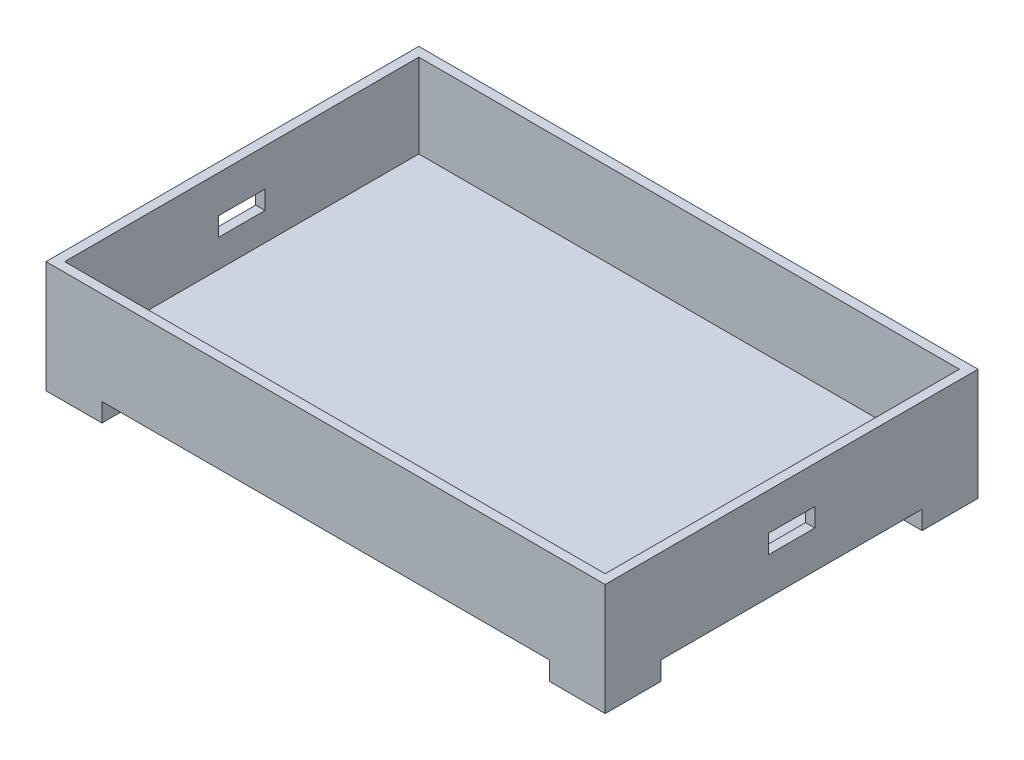
ISO-10303-21;
HEADER;
FILE_DESCRIPTION(('STEP AP214'),'2;1');
FILE_NAME('part.step','',(''),(''),'','','');
FILE_SCHEMA(('AUTOMOTIVE_DESIGN { 1 0 10303 214 1 1 1 1 }'));
ENDSEC;
DATA;
#1=APPLICATION_CONTEXT('core data for automotive mechanical design processes');
#2=APPLICATION_PROTOCOL_DEFINITION('international standard','automotive_design',2000,#1);
#3=PRODUCT_CONTEXT('',#1,'mechanical');
#4=PRODUCT('Part','Part','',(#3));
#5=PRODUCT_RELATED_PRODUCT_CATEGORY('part','',(#4));
#6=PRODUCT_DEFINITION_FORMATION('','',#4);
#7=PRODUCT_DEFINITION_CONTEXT('part definition',#1,'design');
#8=PRODUCT_DEFINITION('design','',#6,#7);
#9=PRODUCT_DEFINITION_SHAPE('','',#8);
#10=(LENGTH_UNIT() NAMED_UNIT(*) SI_UNIT(.MILLI.,.METRE.));
#11=(NAMED_UNIT(*) PLANE_ANGLE_UNIT() SI_UNIT($,.RADIAN.));
#12=(NAMED_UNIT(*) SI_UNIT($,.STERADIAN.) SOLID_ANGLE_UNIT());
#13=UNCERTAINTY_MEASURE_WITH_UNIT(LENGTH_MEASURE(1.E-05),#10,'distance_accuracy_value','');
#14=(GEOMETRIC_REPRESENTATION_CONTEXT(3) GLOBAL_UNCERTAINTY_ASSIGNED_CONTEXT((#13)) GLOBAL_UNIT_ASSIGNED_CONTEXT((#10,
#11,#12)) REPRESENTATION_CONTEXT('',''));
#15=CARTESIAN_POINT('',(0.,0.,0.));
#16=DIRECTION('',(0.,0.,1.));
#17=DIRECTION('',(1.,0.,0.));
#18=AXIS2_PLACEMENT_3D('',#15,#16,#17);
#19=CARTESIAN_POINT('',(0.,0.,0.));
#20=DIRECTION('',(0.,1.,0.));
#21=DIRECTION('',(0.,0.,1.));
#22=AXIS2_PLACEMENT_3D('',#19,#20,#21);
#23=PLANE('',#22);
#24=DIRECTION('',(1.,0.,0.));
#25=VECTOR('',#24,1.);
#26=CARTESIAN_POINT('',(30.,0.,14.));
#27=LINE('',#26,#25);
#28=CARTESIAN_POINT('',(24.,0.,14.));
#29=VERTEX_POINT('',#28);
#30=CARTESIAN_POINT('',(30.,0.,14.));
#31=VERTEX_POINT('',#30);
#32=EDGE_CURVE('E247',#29,#31,#27,.T.);
#33=ORIENTED_EDGE('',*,*,#32,.F.);
#34=DIRECTION('',(0.,0.,-1.));
#35=VECTOR('',#34,1.);
#36=CARTESIAN_POINT('',(24.,0.,14.));
#37=LINE('',#36,#35);
#38=CARTESIAN_POINT('',(24.,0.,20.));
#39=VERTEX_POINT('',#38);
#40=EDGE_CURVE('E235',#39,#29,#37,.T.);
#41=ORIENTED_EDGE('',*,*,#40,.F.);
#42=DIRECTION('',(1.,0.,0.));
#43=VECTOR('',#42,1.);
#44=CARTESIAN_POINT('',(-30.,0.,20.));
#45=LINE('',#44,#43);
#46=CARTESIAN_POINT('',(-24.,0.,20.));
#47=VERTEX_POINT('',#46);
#48=EDGE_CURVE('E476',#47,#39,#45,.T.);
#49=ORIENTED_EDGE('',*,*,#48,.F.);
#50=DIRECTION('',(0.,0.,1.));
#51=VECTOR('',#50,1.);
#52=CARTESIAN_POINT('',(-24.,0.,14.));
#53=LINE('',#52,#51);
#54=CARTESIAN_POINT('',(-24.,0.,14.));
#55=VERTEX_POINT('',#54);
#56=EDGE_CURVE('E339',#55,#47,#53,.T.);
#57=ORIENTED_EDGE('',*,*,#56,.F.);
#58=DIRECTION('',(1.,0.,0.));
#59=VECTOR('',#58,1.);
#60=CARTESIAN_POINT('',(-30.,0.,14.));
#61=LINE('',#60,#59);
#62=CARTESIAN_POINT('',(-30.,0.,14.));
#63=VERTEX_POINT('',#62);
#64=EDGE_CURVE('E322',#63,#55,#61,.T.);
#65=ORIENTED_EDGE('',*,*,#64,.F.);
#66=DIRECTION('',(0.,0.,1.));
#67=VECTOR('',#66,1.);
#68=CARTESIAN_POINT('',(-30.,0.,-20.));
#69=LINE('',#68,#67);
#70=CARTESIAN_POINT('',(-30.,0.,-14.));
#71=VERTEX_POINT('',#70);
#72=EDGE_CURVE('E491',#71,#63,#69,.T.);
#73=ORIENTED_EDGE('',*,*,#72,.F.);
#74=DIRECTION('',(-1.,0.,0.));
#75=VECTOR('',#74,1.);
#76=CARTESIAN_POINT('',(-24.,0.,-14.));
#77=LINE('',#76,#75);
#78=CARTESIAN_POINT('',(-24.,0.,-14.));
#79=VERTEX_POINT('',#78);
#80=EDGE_CURVE('E315',#79,#71,#77,.T.);
#81=ORIENTED_EDGE('',*,*,#80,.F.);
#82=DIRECTION('',(0.,0.,1.));
#83=VECTOR('',#82,1.);
#84=CARTESIAN_POINT('',(-24.,0.,-20.));
#85=LINE('',#84,#83);
#86=CARTESIAN_POINT('',(-24.,0.,-20.));
#87=VERTEX_POINT('',#86);
#88=EDGE_CURVE('E318',#87,#79,#85,.T.);
#89=ORIENTED_EDGE('',*,*,#88,.F.);
#90=DIRECTION('',(-1.,0.,0.));
#91=VECTOR('',#90,1.);
#92=CARTESIAN_POINT('',(-30.,0.,-20.));
#93=LINE('',#92,#91);
#94=CARTESIAN_POINT('',(24.,0.,-20.));
#95=VERTEX_POINT('',#94);
#96=EDGE_CURVE('E488',#95,#87,#93,.T.);
#97=ORIENTED_EDGE('',*,*,#96,.F.);
#98=DIRECTION('',(0.,0.,-1.));
#99=VECTOR('',#98,1.);
#100=CARTESIAN_POINT('',(24.,0.,-20.));
#101=LINE('',#100,#99);
#102=CARTESIAN_POINT('',(24.,0.,-14.));
#103=VERTEX_POINT('',#102);
#104=EDGE_CURVE('E63',#103,#95,#101,.T.);
#105=ORIENTED_EDGE('',*,*,#104,.F.);
#106=DIRECTION('',(-1.,0.,0.));
#107=VECTOR('',#106,1.);
#108=CARTESIAN_POINT('',(24.,0.,-14.));
#109=LINE('',#108,#107);
#110=CARTESIAN_POINT('',(30.,0.,-14.));
#111=VERTEX_POINT('',#110);
#112=EDGE_CURVE('E286',#111,#103,#109,.T.);
#113=ORIENTED_EDGE('',*,*,#112,.F.);
#114=DIRECTION('',(0.,0.,-1.));
#115=VECTOR('',#114,1.);
#116=CARTESIAN_POINT('',(30.,0.,-20.));
#117=LINE('',#116,#115);
#118=EDGE_CURVE('E260',#31,#111,#117,.T.);
#119=ORIENTED_EDGE('',*,*,#118,.F.);
#120=EDGE_LOOP('',(#33,#41,#49,#57,#65,#73,#81,#89,#97,#105,#113,#119));
#121=FACE_BOUND('',#120,.T.);
#122=ADVANCED_FACE('F47',(#121),#23,.F.);
#123=CARTESIAN_POINT('',(30.,10.,-20.));
#124=DIRECTION('',(-1.,0.,0.));
#125=DIRECTION('',(0.,0.,1.));
#126=AXIS2_PLACEMENT_3D('',#123,#124,#125);
#127=PLANE('',#126);
#128=DIRECTION('',(0.,0.,1.));
#129=VECTOR('',#128,1.);
#130=CARTESIAN_POINT('',(30.,4.,-2.5));
#131=LINE('',#130,#129);
#132=CARTESIAN_POINT('',(30.,4.,-2.5));
#133=VERTEX_POINT('',#132);
#134=CARTESIAN_POINT('',(30.,4.,2.5));
#135=VERTEX_POINT('',#134);
#136=EDGE_CURVE('E380',#133,#135,#131,.T.);
#137=ORIENTED_EDGE('',*,*,#136,.T.);
#138=DIRECTION('',(0.,1.,0.));
#139=VECTOR('',#138,1.);
#140=CARTESIAN_POINT('',(30.,6.,2.5));
#141=LINE('',#140,#139);
#142=CARTESIAN_POINT('',(30.,6.,2.5));
#143=VERTEX_POINT('',#142);
#144=EDGE_CURVE('E367',#135,#143,#141,.T.);
#145=ORIENTED_EDGE('',*,*,#144,.T.);
#146=DIRECTION('',(0.,0.,-1.));
#147=VECTOR('',#146,1.);
#148=CARTESIAN_POINT('',(30.,6.,-2.5));
#149=LINE('',#148,#147);
#150=CARTESIAN_POINT('',(30.,6.,-2.5));
#151=VERTEX_POINT('',#150);
#152=EDGE_CURVE('E371',#143,#151,#149,.T.);
#153=ORIENTED_EDGE('',*,*,#152,.T.);
#154=DIRECTION('',(0.,-1.,0.));
#155=VECTOR('',#154,1.);
#156=CARTESIAN_POINT('',(30.,6.,-2.5));
#157=LINE('',#156,#155);
#158=EDGE_CURVE('E376',#151,#133,#157,.T.);
#159=ORIENTED_EDGE('',*,*,#158,.T.);
#160=EDGE_LOOP('',(#137,#145,#153,#159));
#161=FACE_BOUND('',#160,.T.);
#162=DIRECTION('',(0.,-1.,0.));
#163=VECTOR('',#162,1.);
#164=CARTESIAN_POINT('',(30.,10.,20.));
#165=LINE('',#164,#163);
#166=CARTESIAN_POINT('',(30.,10.,20.));
#167=VERTEX_POINT('',#166);
#168=CARTESIAN_POINT('',(30.,-2.,20.));
#169=VERTEX_POINT('',#168);
#170=EDGE_CURVE('E485',#167,#169,#165,.T.);
#171=ORIENTED_EDGE('',*,*,#170,.T.);
#172=DIRECTION('',(0.,0.,1.));
#173=VECTOR('',#172,1.);
#174=CARTESIAN_POINT('',(30.,-2.,20.));
#175=LINE('',#174,#173);
#176=CARTESIAN_POINT('',(30.,-2.,14.));
#177=VERTEX_POINT('',#176);
#178=EDGE_CURVE('E273',#177,#169,#175,.T.);
#179=ORIENTED_EDGE('',*,*,#178,.F.);
#180=DIRECTION('',(0.,1.,0.));
#181=VECTOR('',#180,1.);
#182=CARTESIAN_POINT('',(30.,-2.,14.));
#183=LINE('',#182,#181);
#184=EDGE_CURVE('E853',#177,#31,#183,.T.);
#185=ORIENTED_EDGE('',*,*,#184,.T.);
#186=ORIENTED_EDGE('',*,*,#118,.T.);
#187=DIRECTION('',(0.,1.,0.));
#188=VECTOR('',#187,1.);
#189=CARTESIAN_POINT('',(30.,-2.,-14.));
#190=LINE('',#189,#188);
#191=CARTESIAN_POINT('',(30.,-2.,-14.));
#192=VERTEX_POINT('',#191);
#193=EDGE_CURVE('E265',#192,#111,#190,.T.);
#194=ORIENTED_EDGE('',*,*,#193,.F.);
#195=DIRECTION('',(0.,0.,1.));
#196=VECTOR('',#195,1.);
#197=CARTESIAN_POINT('',(30.,-2.,-14.));
#198=LINE('',#197,#196);
#199=CARTESIAN_POINT('',(30.,-2.,-20.));
#200=VERTEX_POINT('',#199);
#201=EDGE_CURVE('E295',#200,#192,#198,.T.);
#202=ORIENTED_EDGE('',*,*,#201,.F.);
#203=DIRECTION('',(0.,-1.,0.));
#204=VECTOR('',#203,1.);
#205=CARTESIAN_POINT('',(30.,10.,-20.));
#206=LINE('',#205,#204);
#207=CARTESIAN_POINT('',(30.,10.,-20.));
#208=VERTEX_POINT('',#207);
#209=EDGE_CURVE('E504',#208,#200,#206,.T.);
#210=ORIENTED_EDGE('',*,*,#209,.F.);
#211=DIRECTION('',(0.,0.,-1.));
#212=VECTOR('',#211,1.);
#213=CARTESIAN_POINT('',(30.,10.,-20.));
#214=LINE('',#213,#212);
#215=EDGE_CURVE('E471',#167,#208,#214,.T.);
#216=ORIENTED_EDGE('',*,*,#215,.F.);
#217=EDGE_LOOP('',(#171,#179,#185,#186,#194,#202,#210,#216));
#218=FACE_BOUND('',#217,.T.);
#219=ADVANCED_FACE('F49',(#161,#218),#127,.F.);
#220=CARTESIAN_POINT('',(-30.,10.,-20.));
#221=DIRECTION('',(0.,0.,1.));
#222=DIRECTION('',(1.,0.,0.));
#223=AXIS2_PLACEMENT_3D('',#220,#221,#222);
#224=PLANE('',#223);
#225=ORIENTED_EDGE('',*,*,#209,.T.);
#226=DIRECTION('',(1.,0.,0.));
#227=VECTOR('',#226,1.);
#228=CARTESIAN_POINT('',(30.,-2.,-20.));
#229=LINE('',#228,#227);
#230=CARTESIAN_POINT('',(24.,-2.,-20.));
#231=VERTEX_POINT('',#230);
#232=EDGE_CURVE('E298',#231,#200,#229,.T.);
#233=ORIENTED_EDGE('',*,*,#232,.F.);
#234=DIRECTION('',(0.,1.,0.));
#235=VECTOR('',#234,1.);
#236=CARTESIAN_POINT('',(24.,-2.,-20.));
#237=LINE('',#236,#235);
#238=EDGE_CURVE('E262',#231,#95,#237,.T.);
#239=ORIENTED_EDGE('',*,*,#238,.T.);
#240=ORIENTED_EDGE('',*,*,#96,.T.);
#241=DIRECTION('',(0.,1.,0.));
#242=VECTOR('',#241,1.);
#243=CARTESIAN_POINT('',(-24.,-2.,-20.));
#244=LINE('',#243,#242);
#245=CARTESIAN_POINT('',(-24.,-2.,-20.));
#246=VERTEX_POINT('',#245);
#247=EDGE_CURVE('E292',#246,#87,#244,.T.);
#248=ORIENTED_EDGE('',*,*,#247,.F.);
#249=DIRECTION('',(1.,0.,0.));
#250=VECTOR('',#249,1.);
#251=CARTESIAN_POINT('',(-30.,-2.,-20.));
#252=LINE('',#251,#250);
#253=CARTESIAN_POINT('',(-30.,-2.,-20.));
#254=VERTEX_POINT('',#253);
#255=EDGE_CURVE('E328',#254,#246,#252,.T.);
#256=ORIENTED_EDGE('',*,*,#255,.F.);
#257=DIRECTION('',(0.,-1.,0.));
#258=VECTOR('',#257,1.);
#259=CARTESIAN_POINT('',(-30.,10.,-20.));
#260=LINE('',#259,#258);
#261=CARTESIAN_POINT('',(-30.,10.,-20.));
#262=VERTEX_POINT('',#261);
#263=EDGE_CURVE('E501',#262,#254,#260,.T.);
#264=ORIENTED_EDGE('',*,*,#263,.F.);
#265=DIRECTION('',(-1.,0.,0.));
#266=VECTOR('',#265,1.);
#267=CARTESIAN_POINT('',(-30.,10.,-20.));
#268=LINE('',#267,#266);
#269=EDGE_CURVE('E475',#208,#262,#268,.T.);
#270=ORIENTED_EDGE('',*,*,#269,.F.);
#271=EDGE_LOOP('',(#225,#233,#239,#240,#248,#256,#264,#270));
#272=FACE_BOUND('',#271,.T.);
#273=ADVANCED_FACE('F545',(#272),#224,.F.);
#274=CARTESIAN_POINT('',(-30.,10.,-20.));
#275=DIRECTION('',(1.,0.,0.));
#276=DIRECTION('',(0.,0.,-1.));
#277=AXIS2_PLACEMENT_3D('',#274,#275,#276);
#278=PLANE('',#277);
#279=DIRECTION('',(0.,0.,-1.));
#280=VECTOR('',#279,1.);
#281=CARTESIAN_POINT('',(-30.,6.,-2.5));
#282=LINE('',#281,#280);
#283=CARTESIAN_POINT('',(-30.,6.,2.5));
#284=VERTEX_POINT('',#283);
#285=CARTESIAN_POINT('',(-30.,6.,-2.5));
#286=VERTEX_POINT('',#285);
#287=EDGE_CURVE('E387',#284,#286,#282,.T.);
#288=ORIENTED_EDGE('',*,*,#287,.F.);
#289=DIRECTION('',(0.,1.,0.));
#290=VECTOR('',#289,1.);
#291=CARTESIAN_POINT('',(-30.,6.,2.5));
#292=LINE('',#291,#290);
#293=CARTESIAN_POINT('',(-30.,4.,2.5));
#294=VERTEX_POINT('',#293);
#295=EDGE_CURVE('E366',#294,#284,#292,.T.);
#296=ORIENTED_EDGE('',*,*,#295,.F.);
#297=DIRECTION('',(0.,0.,1.));
#298=VECTOR('',#297,1.);
#299=CARTESIAN_POINT('',(-30.,4.,-2.5));
#300=LINE('',#299,#298);
#301=CARTESIAN_POINT('',(-30.,4.,-2.5));
#302=VERTEX_POINT('',#301);
#303=EDGE_CURVE('E372',#302,#294,#300,.T.);
#304=ORIENTED_EDGE('',*,*,#303,.F.);
#305=DIRECTION('',(0.,-1.,0.));
#306=VECTOR('',#305,1.);
#307=CARTESIAN_POINT('',(-30.,6.,-2.5));
#308=LINE('',#307,#306);
#309=EDGE_CURVE('E391',#286,#302,#308,.T.);
#310=ORIENTED_EDGE('',*,*,#309,.F.);
#311=EDGE_LOOP('',(#288,#296,#304,#310));
#312=FACE_BOUND('',#311,.T.);
#313=ORIENTED_EDGE('',*,*,#263,.T.);
#314=DIRECTION('',(0.,0.,-1.));
#315=VECTOR('',#314,1.);
#316=CARTESIAN_POINT('',(-30.,-2.,-14.));
#317=LINE('',#316,#315);
#318=CARTESIAN_POINT('',(-30.,-2.,-14.));
#319=VERTEX_POINT('',#318);
#320=EDGE_CURVE('E319',#319,#254,#317,.T.);
#321=ORIENTED_EDGE('',*,*,#320,.F.);
#322=DIRECTION('',(0.,1.,0.));
#323=VECTOR('',#322,1.);
#324=CARTESIAN_POINT('',(-30.,-2.,-14.));
#325=LINE('',#324,#323);
#326=EDGE_CURVE('E71',#319,#71,#325,.T.);
#327=ORIENTED_EDGE('',*,*,#326,.T.);
#328=ORIENTED_EDGE('',*,*,#72,.T.);
#329=DIRECTION('',(0.,1.,0.));
#330=VECTOR('',#329,1.);
#331=CARTESIAN_POINT('',(-30.,-2.,14.));
#332=LINE('',#331,#330);
#333=CARTESIAN_POINT('',(-30.,-2.,14.));
#334=VERTEX_POINT('',#333);
#335=EDGE_CURVE('E362',#334,#63,#332,.T.);
#336=ORIENTED_EDGE('',*,*,#335,.F.);
#337=DIRECTION('',(0.,0.,-1.));
#338=VECTOR('',#337,1.);
#339=CARTESIAN_POINT('',(-30.,-2.,20.));
#340=LINE('',#339,#338);
#341=CARTESIAN_POINT('',(-30.,-2.,20.));
#342=VERTEX_POINT('',#341);
#343=EDGE_CURVE('E338',#342,#334,#340,.T.);
#344=ORIENTED_EDGE('',*,*,#343,.F.);
#345=DIRECTION('',(0.,-1.,0.));
#346=VECTOR('',#345,1.);
#347=CARTESIAN_POINT('',(-30.,10.,20.));
#348=LINE('',#347,#346);
#349=CARTESIAN_POINT('',(-30.,10.,20.));
#350=VERTEX_POINT('',#349);
#351=EDGE_CURVE('E498',#350,#342,#348,.T.);
#352=ORIENTED_EDGE('',*,*,#351,.F.);
#353=DIRECTION('',(0.,0.,1.));
#354=VECTOR('',#353,1.);
#355=CARTESIAN_POINT('',(-30.,10.,-20.));
#356=LINE('',#355,#354);
#357=EDGE_CURVE('E479',#262,#350,#356,.T.);
#358=ORIENTED_EDGE('',*,*,#357,.F.);
#359=EDGE_LOOP('',(#313,#321,#327,#328,#336,#344,#352,#358));
#360=FACE_BOUND('',#359,.T.);
#361=ADVANCED_FACE('F542',(#312,#360),#278,.F.);
#362=CARTESIAN_POINT('',(-30.,10.,20.));
#363=DIRECTION('',(0.,0.,-1.));
#364=DIRECTION('',(-1.,0.,0.));
#365=AXIS2_PLACEMENT_3D('',#362,#363,#364);
#366=PLANE('',#365);
#367=ORIENTED_EDGE('',*,*,#351,.T.);
#368=DIRECTION('',(-1.,0.,0.));
#369=VECTOR('',#368,1.);
#370=CARTESIAN_POINT('',(-24.,-2.,20.));
#371=LINE('',#370,#369);
#372=CARTESIAN_POINT('',(-24.,-2.,20.));
#373=VERTEX_POINT('',#372);
#374=EDGE_CURVE('E334',#373,#342,#371,.T.);
#375=ORIENTED_EDGE('',*,*,#374,.F.);
#376=DIRECTION('',(0.,1.,0.));
#377=VECTOR('',#376,1.);
#378=CARTESIAN_POINT('',(-24.,-2.,20.));
#379=LINE('',#378,#377);
#380=EDGE_CURVE('E348',#373,#47,#379,.T.);
#381=ORIENTED_EDGE('',*,*,#380,.T.);
#382=ORIENTED_EDGE('',*,*,#48,.T.);
#383=DIRECTION('',(0.,1.,0.));
#384=VECTOR('',#383,1.);
#385=CARTESIAN_POINT('',(24.,-2.,20.));
#386=LINE('',#385,#384);
#387=CARTESIAN_POINT('',(24.,-2.,20.));
#388=VERTEX_POINT('',#387);
#389=EDGE_CURVE('E242',#388,#39,#386,.T.);
#390=ORIENTED_EDGE('',*,*,#389,.F.);
#391=DIRECTION('',(-1.,0.,0.));
#392=VECTOR('',#391,1.);
#393=CARTESIAN_POINT('',(24.,-2.,20.));
#394=LINE('',#393,#392);
#395=EDGE_CURVE('E270',#169,#388,#394,.T.);
#396=ORIENTED_EDGE('',*,*,#395,.F.);
#397=ORIENTED_EDGE('',*,*,#170,.F.);
#398=DIRECTION('',(1.,0.,0.));
#399=VECTOR('',#398,1.);
#400=CARTESIAN_POINT('',(-30.,10.,20.));
#401=LINE('',#400,#399);
#402=EDGE_CURVE('E482',#350,#167,#401,.T.);
#403=ORIENTED_EDGE('',*,*,#402,.F.);
#404=EDGE_LOOP('',(#367,#375,#381,#382,#390,#396,#397,#403));
#405=FACE_BOUND('',#404,.T.);
#406=ADVANCED_FACE('F544',(#405),#366,.F.);
#407=CARTESIAN_POINT('',(0.,10.,0.));
#408=DIRECTION('',(0.,1.,0.));
#409=DIRECTION('',(0.,0.,1.));
#410=AXIS2_PLACEMENT_3D('',#407,#408,#409);
#411=PLANE('',#410);
#412=DIRECTION('',(0.,0.,-1.));
#413=VECTOR('',#412,1.);
#414=CARTESIAN_POINT('',(29.,10.,-20.));
#415=LINE('',#414,#413);
#416=CARTESIAN_POINT('',(29.,10.,19.));
#417=VERTEX_POINT('',#416);
#418=CARTESIAN_POINT('',(29.,10.,-19.));
#419=VERTEX_POINT('',#418);
#420=EDGE_CURVE('E459',#417,#419,#415,.T.);
#421=ORIENTED_EDGE('',*,*,#420,.F.);
#422=DIRECTION('',(1.,0.,0.));
#423=VECTOR('',#422,1.);
#424=CARTESIAN_POINT('',(-30.,10.,19.));
#425=LINE('',#424,#423);
#426=CARTESIAN_POINT('',(-29.,10.,19.));
#427=VERTEX_POINT('',#426);
#428=EDGE_CURVE('E444',#427,#417,#425,.T.);
#429=ORIENTED_EDGE('',*,*,#428,.F.);
#430=DIRECTION('',(0.,0.,1.));
#431=VECTOR('',#430,1.);
#432=CARTESIAN_POINT('',(-29.,10.,-20.));
#433=LINE('',#432,#431);
#434=CARTESIAN_POINT('',(-29.,10.,-19.));
#435=VERTEX_POINT('',#434);
#436=EDGE_CURVE('E465',#435,#427,#433,.T.);
#437=ORIENTED_EDGE('',*,*,#436,.F.);
#438=DIRECTION('',(-1.,0.,0.));
#439=VECTOR('',#438,1.);
#440=CARTESIAN_POINT('',(-30.,10.,-19.));
#441=LINE('',#440,#439);
#442=EDGE_CURVE('E462',#419,#435,#441,.T.);
#443=ORIENTED_EDGE('',*,*,#442,.F.);
#444=EDGE_LOOP('',(#421,#429,#437,#443));
#445=FACE_BOUND('',#444,.T.);
#446=ORIENTED_EDGE('',*,*,#215,.T.);
#447=ORIENTED_EDGE('',*,*,#269,.T.);
#448=ORIENTED_EDGE('',*,*,#357,.T.);
#449=ORIENTED_EDGE('',*,*,#402,.T.);
#450=EDGE_LOOP('',(#446,#447,#448,#449));
#451=FACE_BOUND('',#450,.T.);
#452=ADVANCED_FACE('F581',(#445,#451),#411,.T.);
#453=CARTESIAN_POINT('',(29.,10.,-20.));
#454=DIRECTION('',(-1.,0.,0.));
#455=DIRECTION('',(0.,0.,1.));
#456=AXIS2_PLACEMENT_3D('',#453,#454,#455);
#457=PLANE('',#456);
#458=DIRECTION('',(0.,1.,0.));
#459=VECTOR('',#458,1.);
#460=CARTESIAN_POINT('',(29.,10.,2.5));
#461=LINE('',#460,#459);
#462=CARTESIAN_POINT('',(29.,4.,2.5));
#463=VERTEX_POINT('',#462);
#464=CARTESIAN_POINT('',(29.,6.,2.5));
#465=VERTEX_POINT('',#464);
#466=EDGE_CURVE('E425',#463,#465,#461,.T.);
#467=ORIENTED_EDGE('',*,*,#466,.F.);
#468=DIRECTION('',(0.,0.,1.));
#469=VECTOR('',#468,1.);
#470=CARTESIAN_POINT('',(29.,4.,-20.));
#471=LINE('',#470,#469);
#472=CARTESIAN_POINT('',(29.,4.,-2.5));
#473=VERTEX_POINT('',#472);
#474=EDGE_CURVE('E422',#473,#463,#471,.T.);
#475=ORIENTED_EDGE('',*,*,#474,.F.);
#476=DIRECTION('',(0.,-1.,0.));
#477=VECTOR('',#476,1.);
#478=CARTESIAN_POINT('',(29.,10.,-2.5));
#479=LINE('',#478,#477);
#480=CARTESIAN_POINT('',(29.,6.,-2.5));
#481=VERTEX_POINT('',#480);
#482=EDGE_CURVE('E419',#481,#473,#479,.T.);
#483=ORIENTED_EDGE('',*,*,#482,.F.);
#484=DIRECTION('',(0.,0.,-1.));
#485=VECTOR('',#484,1.);
#486=CARTESIAN_POINT('',(29.,6.,-20.));
#487=LINE('',#486,#485);
#488=EDGE_CURVE('E402',#465,#481,#487,.T.);
#489=ORIENTED_EDGE('',*,*,#488,.F.);
#490=EDGE_LOOP('',(#467,#475,#483,#489));
#491=FACE_BOUND('',#490,.T.);
#492=DIRECTION('',(0.,0.,-1.));
#493=VECTOR('',#492,1.);
#494=CARTESIAN_POINT('',(29.,0.999999999999999,-20.));
#495=LINE('',#494,#493);
#496=CARTESIAN_POINT('',(29.,1.,19.));
#497=VERTEX_POINT('',#496);
#498=CARTESIAN_POINT('',(29.,1.,-19.));
#499=VERTEX_POINT('',#498);
#500=EDGE_CURVE('E429',#497,#499,#495,.T.);
#501=ORIENTED_EDGE('',*,*,#500,.F.);
#502=DIRECTION('',(0.,-1.,0.));
#503=VECTOR('',#502,1.);
#504=CARTESIAN_POINT('',(29.,10.,19.));
#505=LINE('',#504,#503);
#506=EDGE_CURVE('E439',#417,#497,#505,.T.);
#507=ORIENTED_EDGE('',*,*,#506,.F.);
#508=ORIENTED_EDGE('',*,*,#420,.T.);
#509=DIRECTION('',(0.,-1.,0.));
#510=VECTOR('',#509,1.);
#511=CARTESIAN_POINT('',(29.,10.,-19.));
#512=LINE('',#511,#510);
#513=EDGE_CURVE('E434',#419,#499,#512,.T.);
#514=ORIENTED_EDGE('',*,*,#513,.T.);
#515=EDGE_LOOP('',(#501,#507,#508,#514));
#516=FACE_BOUND('',#515,.T.);
#517=ADVANCED_FACE('F711',(#491,#516),#457,.T.);
#518=CARTESIAN_POINT('',(-30.,10.,-19.));
#519=DIRECTION('',(0.,0.,1.));
#520=DIRECTION('',(1.,0.,0.));
#521=AXIS2_PLACEMENT_3D('',#518,#519,#520);
#522=PLANE('',#521);
#523=DIRECTION('',(-1.,0.,0.));
#524=VECTOR('',#523,1.);
#525=CARTESIAN_POINT('',(-30.,0.999999999999999,-19.));
#526=LINE('',#525,#524);
#527=CARTESIAN_POINT('',(-29.,1.,-19.));
#528=VERTEX_POINT('',#527);
#529=EDGE_CURVE('E433',#499,#528,#526,.T.);
#530=ORIENTED_EDGE('',*,*,#529,.F.);
#531=ORIENTED_EDGE('',*,*,#513,.F.);
#532=ORIENTED_EDGE('',*,*,#442,.T.);
#533=DIRECTION('',(0.,-1.,0.));
#534=VECTOR('',#533,1.);
#535=CARTESIAN_POINT('',(-29.,10.,-19.));
#536=LINE('',#535,#534);
#537=EDGE_CURVE('E438',#435,#528,#536,.T.);
#538=ORIENTED_EDGE('',*,*,#537,.T.);
#539=EDGE_LOOP('',(#530,#531,#532,#538));
#540=FACE_BOUND('',#539,.T.);
#541=ADVANCED_FACE('F704',(#540),#522,.T.);
#542=CARTESIAN_POINT('',(-29.,10.,-20.));
#543=DIRECTION('',(1.,0.,0.));
#544=DIRECTION('',(0.,0.,-1.));
#545=AXIS2_PLACEMENT_3D('',#542,#543,#544);
#546=PLANE('',#545);
#547=DIRECTION('',(0.,-1.,0.));
#548=VECTOR('',#547,1.);
#549=CARTESIAN_POINT('',(-29.,10.,2.5));
#550=LINE('',#549,#548);
#551=CARTESIAN_POINT('',(-29.,6.,2.5));
#552=VERTEX_POINT('',#551);
#553=CARTESIAN_POINT('',(-29.,4.,2.5));
#554=VERTEX_POINT('',#553);
#555=EDGE_CURVE('E11',#552,#554,#550,.T.);
#556=ORIENTED_EDGE('',*,*,#555,.F.);
#557=DIRECTION('',(0.,0.,1.));
#558=VECTOR('',#557,1.);
#559=CARTESIAN_POINT('',(-29.,6.,-20.));
#560=LINE('',#559,#558);
#561=CARTESIAN_POINT('',(-29.,6.,-2.5));
#562=VERTEX_POINT('',#561);
#563=EDGE_CURVE('E507',#562,#552,#560,.T.);
#564=ORIENTED_EDGE('',*,*,#563,.F.);
#565=DIRECTION('',(0.,1.,0.));
#566=VECTOR('',#565,1.);
#567=CARTESIAN_POINT('',(-29.,10.,-2.5));
#568=LINE('',#567,#566);
#569=CARTESIAN_POINT('',(-29.,4.,-2.5));
#570=VERTEX_POINT('',#569);
#571=EDGE_CURVE('E510',#570,#562,#568,.T.);
#572=ORIENTED_EDGE('',*,*,#571,.F.);
#573=DIRECTION('',(0.,0.,-1.));
#574=VECTOR('',#573,1.);
#575=CARTESIAN_POINT('',(-29.,4.,-20.));
#576=LINE('',#575,#574);
#577=EDGE_CURVE('E56',#554,#570,#576,.T.);
#578=ORIENTED_EDGE('',*,*,#577,.F.);
#579=EDGE_LOOP('',(#556,#564,#572,#578));
#580=FACE_BOUND('',#579,.T.);
#581=DIRECTION('',(0.,0.,1.));
#582=VECTOR('',#581,1.);
#583=CARTESIAN_POINT('',(-29.,0.999999999999999,-20.));
#584=LINE('',#583,#582);
#585=CARTESIAN_POINT('',(-29.,1.,19.));
#586=VERTEX_POINT('',#585);
#587=EDGE_CURVE('E447',#528,#586,#584,.T.);
#588=ORIENTED_EDGE('',*,*,#587,.F.);
#589=ORIENTED_EDGE('',*,*,#537,.F.);
#590=ORIENTED_EDGE('',*,*,#436,.T.);
#591=DIRECTION('',(0.,-1.,0.));
#592=VECTOR('',#591,1.);
#593=CARTESIAN_POINT('',(-29.,10.,19.));
#594=LINE('',#593,#592);
#595=EDGE_CURVE('E443',#427,#586,#594,.T.);
#596=ORIENTED_EDGE('',*,*,#595,.T.);
#597=EDGE_LOOP('',(#588,#589,#590,#596));
#598=FACE_BOUND('',#597,.T.);
#599=ADVANCED_FACE('F528',(#580,#598),#546,.T.);
#600=CARTESIAN_POINT('',(-30.,10.,19.));
#601=DIRECTION('',(0.,0.,-1.));
#602=DIRECTION('',(-1.,0.,0.));
#603=AXIS2_PLACEMENT_3D('',#600,#601,#602);
#604=PLANE('',#603);
#605=DIRECTION('',(1.,0.,0.));
#606=VECTOR('',#605,1.);
#607=CARTESIAN_POINT('',(-30.,0.999999999999999,19.));
#608=LINE('',#607,#606);
#609=EDGE_CURVE('E453',#586,#497,#608,.T.);
#610=ORIENTED_EDGE('',*,*,#609,.F.);
#611=ORIENTED_EDGE('',*,*,#595,.F.);
#612=ORIENTED_EDGE('',*,*,#428,.T.);
#613=ORIENTED_EDGE('',*,*,#506,.T.);
#614=EDGE_LOOP('',(#610,#611,#612,#613));
#615=FACE_BOUND('',#614,.T.);
#616=ADVANCED_FACE('F703',(#615),#604,.T.);
#617=CARTESIAN_POINT('',(0.,1.,0.));
#618=DIRECTION('',(0.,1.,0.));
#619=DIRECTION('',(0.,0.,1.));
#620=AXIS2_PLACEMENT_3D('',#617,#618,#619);
#621=PLANE('',#620);
#622=ORIENTED_EDGE('',*,*,#500,.T.);
#623=ORIENTED_EDGE('',*,*,#529,.T.);
#624=ORIENTED_EDGE('',*,*,#587,.T.);
#625=ORIENTED_EDGE('',*,*,#609,.T.);
#626=EDGE_LOOP('',(#622,#623,#624,#625));
#627=FACE_BOUND('',#626,.T.);
#628=ADVANCED_FACE('F695',(#627),#621,.T.);
#629=CARTESIAN_POINT('',(30.,6.,-2.5));
#630=DIRECTION('',(0.,1.,0.));
#631=DIRECTION('',(0.,0.,1.));
#632=AXIS2_PLACEMENT_3D('',#629,#630,#631);
#633=PLANE('',#632);
#634=ORIENTED_EDGE('',*,*,#563,.T.);
#635=DIRECTION('',(-1.,0.,0.));
#636=VECTOR('',#635,1.);
#637=CARTESIAN_POINT('',(30.,6.,2.5));
#638=LINE('',#637,#636);
#639=EDGE_CURVE('E384',#552,#284,#638,.T.);
#640=ORIENTED_EDGE('',*,*,#639,.T.);
#641=ORIENTED_EDGE('',*,*,#287,.T.);
#642=DIRECTION('',(-1.,0.,0.));
#643=VECTOR('',#642,1.);
#644=CARTESIAN_POINT('',(30.,6.,-2.5));
#645=LINE('',#644,#643);
#646=EDGE_CURVE('E413',#562,#286,#645,.T.);
#647=ORIENTED_EDGE('',*,*,#646,.F.);
#648=EDGE_LOOP('',(#634,#640,#641,#647));
#649=FACE_BOUND('',#648,.T.);
#650=ADVANCED_FACE('F533',(#649),#633,.F.);
#651=CARTESIAN_POINT('',(30.,6.,-2.5));
#652=DIRECTION('',(0.,0.,-1.));
#653=DIRECTION('',(0.,1.,0.));
#654=AXIS2_PLACEMENT_3D('',#651,#652,#653);
#655=PLANE('',#654);
#656=ORIENTED_EDGE('',*,*,#571,.T.);
#657=ORIENTED_EDGE('',*,*,#646,.T.);
#658=ORIENTED_EDGE('',*,*,#309,.T.);
#659=DIRECTION('',(-1.,0.,0.));
#660=VECTOR('',#659,1.);
#661=CARTESIAN_POINT('',(30.,4.,-2.5));
#662=LINE('',#661,#660);
#663=EDGE_CURVE('E408',#570,#302,#662,.T.);
#664=ORIENTED_EDGE('',*,*,#663,.F.);
#665=EDGE_LOOP('',(#656,#657,#658,#664));
#666=FACE_BOUND('',#665,.T.);
#667=ADVANCED_FACE('F523',(#666),#655,.F.);
#668=CARTESIAN_POINT('',(30.,4.,-2.5));
#669=DIRECTION('',(0.,-1.,0.));
#670=DIRECTION('',(0.,0.,-1.));
#671=AXIS2_PLACEMENT_3D('',#668,#669,#670);
#672=PLANE('',#671);
#673=ORIENTED_EDGE('',*,*,#577,.T.);
#674=ORIENTED_EDGE('',*,*,#663,.T.);
#675=ORIENTED_EDGE('',*,*,#303,.T.);
#676=DIRECTION('',(-1.,0.,0.));
#677=VECTOR('',#676,1.);
#678=CARTESIAN_POINT('',(30.,4.,2.5));
#679=LINE('',#678,#677);
#680=EDGE_CURVE('E403',#554,#294,#679,.T.);
#681=ORIENTED_EDGE('',*,*,#680,.F.);
#682=EDGE_LOOP('',(#673,#674,#675,#681));
#683=FACE_BOUND('',#682,.T.);
#684=ADVANCED_FACE('F518',(#683),#672,.F.);
#685=CARTESIAN_POINT('',(30.,6.,2.5));
#686=DIRECTION('',(0.,0.,1.));
#687=DIRECTION('',(1.,0.,0.));
#688=AXIS2_PLACEMENT_3D('',#685,#686,#687);
#689=PLANE('',#688);
#690=ORIENTED_EDGE('',*,*,#555,.T.);
#691=ORIENTED_EDGE('',*,*,#680,.T.);
#692=ORIENTED_EDGE('',*,*,#295,.T.);
#693=ORIENTED_EDGE('',*,*,#639,.F.);
#694=EDGE_LOOP('',(#690,#691,#692,#693));
#695=FACE_BOUND('',#694,.T.);
#696=ADVANCED_FACE('F536',(#695),#689,.F.);
#697=ORIENTED_EDGE('',*,*,#466,.T.);
#698=EDGE_CURVE('E414',#143,#465,#638,.T.);
#699=ORIENTED_EDGE('',*,*,#698,.F.);
#700=ORIENTED_EDGE('',*,*,#144,.F.);
#701=EDGE_CURVE('E398',#135,#463,#679,.T.);
#702=ORIENTED_EDGE('',*,*,#701,.T.);
#703=EDGE_LOOP('',(#697,#699,#700,#702));
#704=FACE_BOUND('',#703,.T.);
#705=ADVANCED_FACE('F660',(#704),#689,.F.);
#706=ORIENTED_EDGE('',*,*,#474,.T.);
#707=ORIENTED_EDGE('',*,*,#701,.F.);
#708=ORIENTED_EDGE('',*,*,#136,.F.);
#709=EDGE_CURVE('E404',#133,#473,#662,.T.);
#710=ORIENTED_EDGE('',*,*,#709,.T.);
#711=EDGE_LOOP('',(#706,#707,#708,#710));
#712=FACE_BOUND('',#711,.T.);
#713=ADVANCED_FACE('F651',(#712),#672,.F.);
#714=ORIENTED_EDGE('',*,*,#482,.T.);
#715=ORIENTED_EDGE('',*,*,#709,.F.);
#716=ORIENTED_EDGE('',*,*,#158,.F.);
#717=EDGE_CURVE('E409',#151,#481,#645,.T.);
#718=ORIENTED_EDGE('',*,*,#717,.T.);
#719=EDGE_LOOP('',(#714,#715,#716,#718));
#720=FACE_BOUND('',#719,.T.);
#721=ADVANCED_FACE('F642',(#720),#655,.F.);
#722=ORIENTED_EDGE('',*,*,#488,.T.);
#723=ORIENTED_EDGE('',*,*,#717,.F.);
#724=ORIENTED_EDGE('',*,*,#152,.F.);
#725=ORIENTED_EDGE('',*,*,#698,.T.);
#726=EDGE_LOOP('',(#722,#723,#724,#725));
#727=FACE_BOUND('',#726,.T.);
#728=ADVANCED_FACE('F639',(#727),#633,.F.);
#729=CARTESIAN_POINT('',(-30.,-2.,14.));
#730=DIRECTION('',(0.,0.,1.));
#731=DIRECTION('',(1.,0.,0.));
#732=AXIS2_PLACEMENT_3D('',#729,#730,#731);
#733=PLANE('',#732);
#734=ORIENTED_EDGE('',*,*,#64,.T.);
#735=DIRECTION('',(0.,1.,0.));
#736=VECTOR('',#735,1.);
#737=CARTESIAN_POINT('',(-24.,-2.,14.));
#738=LINE('',#737,#736);
#739=CARTESIAN_POINT('',(-24.,-2.,14.));
#740=VERTEX_POINT('',#739);
#741=EDGE_CURVE('E358',#740,#55,#738,.T.);
#742=ORIENTED_EDGE('',*,*,#741,.F.);
#743=DIRECTION('',(1.,0.,0.));
#744=VECTOR('',#743,1.);
#745=CARTESIAN_POINT('',(-30.,-2.,14.));
#746=LINE('',#745,#744);
#747=EDGE_CURVE('E342',#334,#740,#746,.T.);
#748=ORIENTED_EDGE('',*,*,#747,.F.);
#749=ORIENTED_EDGE('',*,*,#335,.T.);
#750=EDGE_LOOP('',(#734,#742,#748,#749));
#751=FACE_BOUND('',#750,.T.);
#752=ADVANCED_FACE('F569',(#751),#733,.F.);
#753=CARTESIAN_POINT('',(-24.,-2.,14.));
#754=DIRECTION('',(-1.,0.,0.));
#755=DIRECTION('',(0.,0.,1.));
#756=AXIS2_PLACEMENT_3D('',#753,#754,#755);
#757=PLANE('',#756);
#758=ORIENTED_EDGE('',*,*,#56,.T.);
#759=ORIENTED_EDGE('',*,*,#380,.F.);
#760=DIRECTION('',(0.,0.,1.));
#761=VECTOR('',#760,1.);
#762=CARTESIAN_POINT('',(-24.,-2.,14.));
#763=LINE('',#762,#761);
#764=EDGE_CURVE('E345',#740,#373,#763,.T.);
#765=ORIENTED_EDGE('',*,*,#764,.F.);
#766=ORIENTED_EDGE('',*,*,#741,.T.);
#767=EDGE_LOOP('',(#758,#759,#765,#766));
#768=FACE_BOUND('',#767,.T.);
#769=ADVANCED_FACE('F604',(#768),#757,.F.);
#770=CARTESIAN_POINT('',(0.,-2.,0.));
#771=DIRECTION('',(0.,-1.,0.));
#772=DIRECTION('',(0.,0.,-1.));
#773=AXIS2_PLACEMENT_3D('',#770,#771,#772);
#774=PLANE('',#773);
#775=ORIENTED_EDGE('',*,*,#374,.T.);
#776=ORIENTED_EDGE('',*,*,#343,.T.);
#777=ORIENTED_EDGE('',*,*,#747,.T.);
#778=ORIENTED_EDGE('',*,*,#764,.T.);
#779=EDGE_LOOP('',(#775,#776,#777,#778));
#780=FACE_BOUND('',#779,.T.);
#781=ADVANCED_FACE('F572',(#780),#774,.T.);
#782=CARTESIAN_POINT('',(-24.,-2.,-20.));
#783=DIRECTION('',(-1.,0.,0.));
#784=DIRECTION('',(0.,0.,1.));
#785=AXIS2_PLACEMENT_3D('',#782,#783,#784);
#786=PLANE('',#785);
#787=ORIENTED_EDGE('',*,*,#88,.T.);
#788=DIRECTION('',(0.,1.,0.));
#789=VECTOR('',#788,1.);
#790=CARTESIAN_POINT('',(-24.,-2.,-14.));
#791=LINE('',#790,#789);
#792=CARTESIAN_POINT('',(-24.,-2.,-14.));
#793=VERTEX_POINT('',#792);
#794=EDGE_CURVE('E308',#793,#79,#791,.T.);
#795=ORIENTED_EDGE('',*,*,#794,.F.);
#796=DIRECTION('',(0.,0.,1.));
#797=VECTOR('',#796,1.);
#798=CARTESIAN_POINT('',(-24.,-2.,-20.));
#799=LINE('',#798,#797);
#800=EDGE_CURVE('E325',#246,#793,#799,.T.);
#801=ORIENTED_EDGE('',*,*,#800,.F.);
#802=ORIENTED_EDGE('',*,*,#247,.T.);
#803=EDGE_LOOP('',(#787,#795,#801,#802));
#804=FACE_BOUND('',#803,.T.);
#805=ADVANCED_FACE('F596',(#804),#786,.F.);
#806=CARTESIAN_POINT('',(-24.,-2.,-14.));
#807=DIRECTION('',(0.,0.,-1.));
#808=DIRECTION('',(-1.,0.,0.));
#809=AXIS2_PLACEMENT_3D('',#806,#807,#808);
#810=PLANE('',#809);
#811=ORIENTED_EDGE('',*,*,#80,.T.);
#812=ORIENTED_EDGE('',*,*,#326,.F.);
#813=DIRECTION('',(-1.,0.,0.));
#814=VECTOR('',#813,1.);
#815=CARTESIAN_POINT('',(-24.,-2.,-14.));
#816=LINE('',#815,#814);
#817=EDGE_CURVE('E314',#793,#319,#816,.T.);
#818=ORIENTED_EDGE('',*,*,#817,.F.);
#819=ORIENTED_EDGE('',*,*,#794,.T.);
#820=EDGE_LOOP('',(#811,#812,#818,#819));
#821=FACE_BOUND('',#820,.T.);
#822=ADVANCED_FACE('F559',(#821),#810,.F.);
#823=CARTESIAN_POINT('',(0.,-2.,0.));
#824=DIRECTION('',(0.,-1.,0.));
#825=DIRECTION('',(0.,0.,-1.));
#826=AXIS2_PLACEMENT_3D('',#823,#824,#825);
#827=PLANE('',#826);
#828=ORIENTED_EDGE('',*,*,#320,.T.);
#829=ORIENTED_EDGE('',*,*,#255,.T.);
#830=ORIENTED_EDGE('',*,*,#800,.T.);
#831=ORIENTED_EDGE('',*,*,#817,.T.);
#832=EDGE_LOOP('',(#828,#829,#830,#831));
#833=FACE_BOUND('',#832,.T.);
#834=ADVANCED_FACE('F555',(#833),#827,.T.);
#835=CARTESIAN_POINT('',(24.,-2.,-20.));
#836=DIRECTION('',(1.,0.,0.));
#837=DIRECTION('',(0.,0.,-1.));
#838=AXIS2_PLACEMENT_3D('',#835,#836,#837);
#839=PLANE('',#838);
#840=ORIENTED_EDGE('',*,*,#104,.T.);
#841=ORIENTED_EDGE('',*,*,#238,.F.);
#842=DIRECTION('',(0.,0.,-1.));
#843=VECTOR('',#842,1.);
#844=CARTESIAN_POINT('',(24.,-2.,-20.));
#845=LINE('',#844,#843);
#846=CARTESIAN_POINT('',(24.,-2.,-14.));
#847=VERTEX_POINT('',#846);
#848=EDGE_CURVE('E289',#847,#231,#845,.T.);
#849=ORIENTED_EDGE('',*,*,#848,.F.);
#850=DIRECTION('',(0.,1.,0.));
#851=VECTOR('',#850,1.);
#852=CARTESIAN_POINT('',(24.,-2.,-14.));
#853=LINE('',#852,#851);
#854=EDGE_CURVE('E282',#847,#103,#853,.T.);
#855=ORIENTED_EDGE('',*,*,#854,.T.);
#856=EDGE_LOOP('',(#840,#841,#849,#855));
#857=FACE_BOUND('',#856,.T.);
#858=ADVANCED_FACE('F593',(#857),#839,.F.);
#859=CARTESIAN_POINT('',(24.,-2.,-14.));
#860=DIRECTION('',(0.,0.,-1.));
#861=DIRECTION('',(-1.,0.,0.));
#862=AXIS2_PLACEMENT_3D('',#859,#860,#861);
#863=PLANE('',#862);
#864=ORIENTED_EDGE('',*,*,#112,.T.);
#865=ORIENTED_EDGE('',*,*,#854,.F.);
#866=DIRECTION('',(-1.,0.,0.));
#867=VECTOR('',#866,1.);
#868=CARTESIAN_POINT('',(24.,-2.,-14.));
#869=LINE('',#868,#867);
#870=EDGE_CURVE('E285',#192,#847,#869,.T.);
#871=ORIENTED_EDGE('',*,*,#870,.F.);
#872=ORIENTED_EDGE('',*,*,#193,.T.);
#873=EDGE_LOOP('',(#864,#865,#871,#872));
#874=FACE_BOUND('',#873,.T.);
#875=ADVANCED_FACE('F592',(#874),#863,.F.);
#876=CARTESIAN_POINT('',(0.,-2.,0.));
#877=DIRECTION('',(0.,1.,0.));
#878=DIRECTION('',(0.,0.,1.));
#879=AXIS2_PLACEMENT_3D('',#876,#877,#878);
#880=PLANE('',#879);
#881=ORIENTED_EDGE('',*,*,#848,.T.);
#882=ORIENTED_EDGE('',*,*,#232,.T.);
#883=ORIENTED_EDGE('',*,*,#201,.T.);
#884=ORIENTED_EDGE('',*,*,#870,.T.);
#885=EDGE_LOOP('',(#881,#882,#883,#884));
#886=FACE_BOUND('',#885,.T.);
#887=ADVANCED_FACE('F586',(#886),#880,.F.);
#888=CARTESIAN_POINT('',(30.,-2.,14.));
#889=DIRECTION('',(0.,0.,1.));
#890=DIRECTION('',(1.,0.,0.));
#891=AXIS2_PLACEMENT_3D('',#888,#889,#890);
#892=PLANE('',#891);
#893=ORIENTED_EDGE('',*,*,#32,.T.);
#894=ORIENTED_EDGE('',*,*,#184,.F.);
#895=DIRECTION('',(1.,0.,0.));
#896=VECTOR('',#895,1.);
#897=CARTESIAN_POINT('',(30.,-2.,14.));
#898=LINE('',#897,#896);
#899=CARTESIAN_POINT('',(24.,-2.,14.));
#900=VERTEX_POINT('',#899);
#901=EDGE_CURVE('E248',#900,#177,#898,.T.);
#902=ORIENTED_EDGE('',*,*,#901,.F.);
#903=DIRECTION('',(0.,1.,0.));
#904=VECTOR('',#903,1.);
#905=CARTESIAN_POINT('',(24.,-2.,14.));
#906=LINE('',#905,#904);
#907=EDGE_CURVE('E239',#900,#29,#906,.T.);
#908=ORIENTED_EDGE('',*,*,#907,.T.);
#909=EDGE_LOOP('',(#893,#894,#902,#908));
#910=FACE_BOUND('',#909,.T.);
#911=ADVANCED_FACE('F252',(#910),#892,.F.);
#912=CARTESIAN_POINT('',(24.,-2.,14.));
#913=DIRECTION('',(1.,0.,0.));
#914=DIRECTION('',(0.,0.,-1.));
#915=AXIS2_PLACEMENT_3D('',#912,#913,#914);
#916=PLANE('',#915);
#917=ORIENTED_EDGE('',*,*,#40,.T.);
#918=ORIENTED_EDGE('',*,*,#907,.F.);
#919=DIRECTION('',(0.,0.,-1.));
#920=VECTOR('',#919,1.);
#921=CARTESIAN_POINT('',(24.,-2.,14.));
#922=LINE('',#921,#920);
#923=EDGE_CURVE('E257',#388,#900,#922,.T.);
#924=ORIENTED_EDGE('',*,*,#923,.F.);
#925=ORIENTED_EDGE('',*,*,#389,.T.);
#926=EDGE_LOOP('',(#917,#918,#924,#925));
#927=FACE_BOUND('',#926,.T.);
#928=ADVANCED_FACE('F237',(#927),#916,.F.);
#929=CARTESIAN_POINT('',(0.,-2.,0.));
#930=DIRECTION('',(0.,1.,0.));
#931=DIRECTION('',(0.,0.,1.));
#932=AXIS2_PLACEMENT_3D('',#929,#930,#931);
#933=PLANE('',#932);
#934=ORIENTED_EDGE('',*,*,#901,.T.);
#935=ORIENTED_EDGE('',*,*,#178,.T.);
#936=ORIENTED_EDGE('',*,*,#395,.T.);
#937=ORIENTED_EDGE('',*,*,#923,.T.);
#938=EDGE_LOOP('',(#934,#935,#936,#937));
#939=FACE_BOUND('',#938,.T.);
#940=ADVANCED_FACE('F841',(#939),#933,.F.);
#941=CLOSED_SHELL('',(#122,#219,#273,#361,#406,#452,#517,#541,#599,#616,#628,#650,#667,#684,
#696,#705,#713,#721,#728,#752,#769,#781,#805,#822,#834,#858,#875,#887,#911,#928,#940));
#942=MANIFOLD_SOLID_BREP('B2',#941);
#943=ADVANCED_BREP_SHAPE_REPRESENTATION('',(#18,#942),#14);
#944=SHAPE_DEFINITION_REPRESENTATION(#9,#943);
ENDSEC;
END-ISO-10303-21;
